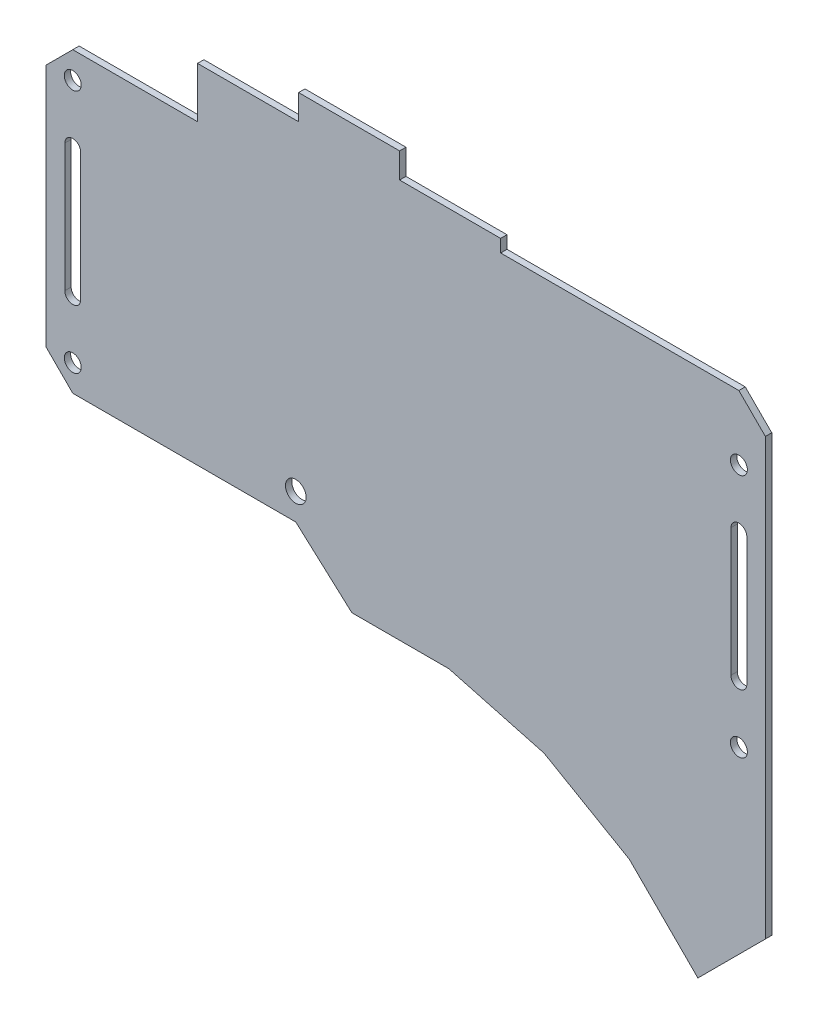
ISO-10303-21;
HEADER;
FILE_DESCRIPTION(('STEP AP214'),'2;1');
FILE_NAME('part.step','',(''),(''),'','','');
FILE_SCHEMA(('AUTOMOTIVE_DESIGN { 1 0 10303 214 1 1 1 1 }'));
ENDSEC;
DATA;
#1=APPLICATION_CONTEXT('core data for automotive mechanical design processes');
#2=APPLICATION_PROTOCOL_DEFINITION('international standard','automotive_design',2000,#1);
#3=PRODUCT_CONTEXT('',#1,'mechanical');
#4=PRODUCT('Part','Part','',(#3));
#5=PRODUCT_RELATED_PRODUCT_CATEGORY('part','',(#4));
#6=PRODUCT_DEFINITION_FORMATION('','',#4);
#7=PRODUCT_DEFINITION_CONTEXT('part definition',#1,'design');
#8=PRODUCT_DEFINITION('design','',#6,#7);
#9=PRODUCT_DEFINITION_SHAPE('','',#8);
#10=(LENGTH_UNIT() NAMED_UNIT(*) SI_UNIT(.MILLI.,.METRE.));
#11=(NAMED_UNIT(*) PLANE_ANGLE_UNIT() SI_UNIT($,.RADIAN.));
#12=(NAMED_UNIT(*) SI_UNIT($,.STERADIAN.) SOLID_ANGLE_UNIT());
#13=UNCERTAINTY_MEASURE_WITH_UNIT(LENGTH_MEASURE(1.E-05),#10,'distance_accuracy_value','');
#14=(GEOMETRIC_REPRESENTATION_CONTEXT(3) GLOBAL_UNCERTAINTY_ASSIGNED_CONTEXT((#13)) GLOBAL_UNIT_ASSIGNED_CONTEXT((#10,
#11,#12)) REPRESENTATION_CONTEXT('',''));
#15=CARTESIAN_POINT('',(0.,0.,0.));
#16=DIRECTION('',(0.,0.,1.));
#17=DIRECTION('',(1.,0.,0.));
#18=AXIS2_PLACEMENT_3D('',#15,#16,#17);
#19=CARTESIAN_POINT('',(0.,0.,1.2));
#20=DIRECTION('',(0.,0.,1.));
#21=DIRECTION('',(1.,0.,0.));
#22=AXIS2_PLACEMENT_3D('',#19,#20,#21);
#23=PLANE('',#22);
#24=CARTESIAN_POINT('',(140.259827188564,42.4727,1.2));
#25=DIRECTION('',(0.,0.,1.));
#26=DIRECTION('',(1.,0.,0.));
#27=AXIS2_PLACEMENT_3D('',#24,#25,#26);
#28=CIRCLE('',#27,1.59999999999999);
#29=CARTESIAN_POINT('',(141.859827188564,42.4727,1.2));
#30=VERTEX_POINT('',#29);
#31=EDGE_CURVE('E866',#30,#30,#28,.T.);
#32=ORIENTED_EDGE('',*,*,#31,.F.);
#33=EDGE_LOOP('',(#32));
#34=FACE_BOUND('',#33,.T.);
#35=CARTESIAN_POINT('',(14.6697,88.5719,1.2));
#36=DIRECTION('',(0.,0.,1.));
#37=DIRECTION('',(1.,0.,0.));
#38=AXIS2_PLACEMENT_3D('',#35,#36,#37);
#39=CIRCLE('',#38,1.6);
#40=CARTESIAN_POINT('',(16.2697,88.5719,1.2));
#41=VERTEX_POINT('',#40);
#42=EDGE_CURVE('E878',#41,#41,#39,.T.);
#43=ORIENTED_EDGE('',*,*,#42,.F.);
#44=EDGE_LOOP('',(#43));
#45=FACE_BOUND('',#44,.T.);
#46=DIRECTION('',(0.,-1.,0.));
#47=VECTOR('',#46,1.);
#48=CARTESIAN_POINT('',(138.759827188564,77.5727,1.2));
#49=LINE('',#48,#47);
#50=CARTESIAN_POINT('',(138.759827188564,77.5727,1.2));
#51=VERTEX_POINT('',#50);
#52=CARTESIAN_POINT('',(138.759827188564,53.4719,1.2));
#53=VERTEX_POINT('',#52);
#54=EDGE_CURVE('E232',#51,#53,#49,.T.);
#55=ORIENTED_EDGE('',*,*,#54,.F.);
#56=CARTESIAN_POINT('',(140.259827188564,77.5727,1.2));
#57=DIRECTION('',(0.,0.,1.));
#58=DIRECTION('',(1.,0.,0.));
#59=AXIS2_PLACEMENT_3D('',#56,#57,#58);
#60=CIRCLE('',#59,1.5);
#61=CARTESIAN_POINT('',(141.759827188564,77.5727,1.2));
#62=VERTEX_POINT('',#61);
#63=EDGE_CURVE('E224',#62,#51,#60,.T.);
#64=ORIENTED_EDGE('',*,*,#63,.F.);
#65=DIRECTION('',(0.,1.,0.));
#66=VECTOR('',#65,1.);
#67=CARTESIAN_POINT('',(141.759827188564,77.5727,1.2));
#68=LINE('',#67,#66);
#69=CARTESIAN_POINT('',(141.759827188564,53.4719,1.2));
#70=VERTEX_POINT('',#69);
#71=EDGE_CURVE('E247',#70,#62,#68,.T.);
#72=ORIENTED_EDGE('',*,*,#71,.F.);
#73=CARTESIAN_POINT('',(140.259827188564,53.4719,1.2));
#74=DIRECTION('',(0.,0.,1.));
#75=DIRECTION('',(1.,0.,0.));
#76=AXIS2_PLACEMENT_3D('',#73,#74,#75);
#77=CIRCLE('',#76,1.5);
#78=EDGE_CURVE('E245',#53,#70,#77,.T.);
#79=ORIENTED_EDGE('',*,*,#78,.F.);
#80=EDGE_LOOP('',(#55,#64,#72,#79));
#81=FACE_BOUND('',#80,.T.);
#82=DIRECTION('',(0.,-1.,0.));
#83=VECTOR('',#82,1.);
#84=CARTESIAN_POINT('',(13.1697,77.5727,1.2));
#85=LINE('',#84,#83);
#86=CARTESIAN_POINT('',(13.1697,77.5727,1.2));
#87=VERTEX_POINT('',#86);
#88=CARTESIAN_POINT('',(13.1697,53.4719,1.2));
#89=VERTEX_POINT('',#88);
#90=EDGE_CURVE('E265',#87,#89,#85,.T.);
#91=ORIENTED_EDGE('',*,*,#90,.F.);
#92=CARTESIAN_POINT('',(14.6697,77.5727,1.2));
#93=DIRECTION('',(0.,0.,1.));
#94=DIRECTION('',(1.,0.,0.));
#95=AXIS2_PLACEMENT_3D('',#92,#93,#94);
#96=CIRCLE('',#95,1.5);
#97=CARTESIAN_POINT('',(16.1697,77.5727,1.2));
#98=VERTEX_POINT('',#97);
#99=EDGE_CURVE('E263',#98,#87,#96,.T.);
#100=ORIENTED_EDGE('',*,*,#99,.F.);
#101=DIRECTION('',(0.,1.,0.));
#102=VECTOR('',#101,1.);
#103=CARTESIAN_POINT('',(16.1697,77.5727,1.2));
#104=LINE('',#103,#102);
#105=CARTESIAN_POINT('',(16.1697,53.4719,1.2));
#106=VERTEX_POINT('',#105);
#107=EDGE_CURVE('E271',#106,#98,#104,.T.);
#108=ORIENTED_EDGE('',*,*,#107,.F.);
#109=CARTESIAN_POINT('',(14.6697,53.4719,1.2));
#110=DIRECTION('',(0.,0.,1.));
#111=DIRECTION('',(1.,0.,0.));
#112=AXIS2_PLACEMENT_3D('',#109,#110,#111);
#113=CIRCLE('',#112,1.5);
#114=EDGE_CURVE('E268',#89,#106,#113,.T.);
#115=ORIENTED_EDGE('',*,*,#114,.F.);
#116=EDGE_LOOP('',(#91,#100,#108,#115));
#117=FACE_BOUND('',#116,.T.);
#118=DIRECTION('',(0.866049982689169,-0.499957425671517,0.));
#119=VECTOR('',#118,1.);
#120=CARTESIAN_POINT('',(119.601627138903,13.8565179668442,1.2));
#121=LINE('',#120,#119);
#122=CARTESIAN_POINT('',(103.516430017738,23.1422565556794,1.2));
#123=VERTEX_POINT('',#122);
#124=CARTESIAN_POINT('',(119.601627138903,13.8565179668442,1.2));
#125=VERTEX_POINT('',#124);
#126=EDGE_CURVE('E294',#123,#125,#121,.T.);
#127=ORIENTED_EDGE('',*,*,#126,.T.);
#128=DIRECTION('',(0.707112852331438,-0.707100709989531,0.));
#129=VECTOR('',#128,1.);
#130=CARTESIAN_POINT('',(132.532309310506,0.926057837258414,1.2));
#131=LINE('',#130,#129);
#132=CARTESIAN_POINT('',(132.532309310506,0.926057837258414,1.2));
#133=VERTEX_POINT('',#132);
#134=EDGE_CURVE('E297',#125,#133,#131,.T.);
#135=ORIENTED_EDGE('',*,*,#134,.T.);
#136=DIRECTION('',(0.70710070998953,0.707112852331438,0.));
#137=VECTOR('',#136,1.);
#138=CARTESIAN_POINT('',(145.259827188564,13.6537942724065,1.2));
#139=LINE('',#138,#137);
#140=CARTESIAN_POINT('',(145.259827188564,13.6537942724065,1.2));
#141=VERTEX_POINT('',#140);
#142=EDGE_CURVE('E300',#133,#141,#139,.T.);
#143=ORIENTED_EDGE('',*,*,#142,.T.);
#144=DIRECTION('',(0.,1.,0.));
#145=VECTOR('',#144,1.);
#146=CARTESIAN_POINT('',(145.259827188564,13.6537942724065,1.2));
#147=LINE('',#146,#145);
#148=CARTESIAN_POINT('',(145.259827188564,95.7157,1.2));
#149=VERTEX_POINT('',#148);
#150=EDGE_CURVE('E302',#141,#149,#147,.T.);
#151=ORIENTED_EDGE('',*,*,#150,.T.);
#152=DIRECTION('',(-0.707106781186547,0.707106781186547,0.));
#153=VECTOR('',#152,1.);
#154=CARTESIAN_POINT('',(145.259827188564,95.7157,1.2));
#155=LINE('',#154,#153);
#156=CARTESIAN_POINT('',(140.259827188564,100.7157,1.2));
#157=VERTEX_POINT('',#156);
#158=EDGE_CURVE('E304',#149,#157,#155,.T.);
#159=ORIENTED_EDGE('',*,*,#158,.T.);
#160=DIRECTION('',(-1.,0.,0.));
#161=VECTOR('',#160,1.);
#162=CARTESIAN_POINT('',(140.259827188564,100.7157,1.2));
#163=LINE('',#162,#161);
#164=CARTESIAN_POINT('',(95.34435,100.7157,1.2));
#165=VERTEX_POINT('',#164);
#166=EDGE_CURVE('E306',#157,#165,#163,.T.);
#167=ORIENTED_EDGE('',*,*,#166,.T.);
#168=DIRECTION('',(0.,1.,0.));
#169=VECTOR('',#168,1.);
#170=CARTESIAN_POINT('',(95.34435,100.7157,1.2));
#171=LINE('',#170,#169);
#172=CARTESIAN_POINT('',(95.34435,103.097,1.2));
#173=VERTEX_POINT('',#172);
#174=EDGE_CURVE('E308',#165,#173,#171,.T.);
#175=ORIENTED_EDGE('',*,*,#174,.T.);
#176=DIRECTION('',(-1.,0.,0.));
#177=VECTOR('',#176,1.);
#178=CARTESIAN_POINT('',(95.34435,103.097,1.2));
#179=LINE('',#178,#177);
#180=CARTESIAN_POINT('',(76.29435,103.097,1.2));
#181=VERTEX_POINT('',#180);
#182=EDGE_CURVE('E310',#173,#181,#179,.T.);
#183=ORIENTED_EDGE('',*,*,#182,.T.);
#184=DIRECTION('',(0.,1.,0.));
#185=VECTOR('',#184,1.);
#186=CARTESIAN_POINT('',(76.29435,103.097,1.2));
#187=LINE('',#186,#185);
#188=CARTESIAN_POINT('',(76.29435,107.859,1.2));
#189=VERTEX_POINT('',#188);
#190=EDGE_CURVE('E312',#181,#189,#187,.T.);
#191=ORIENTED_EDGE('',*,*,#190,.T.);
#192=DIRECTION('',(-1.,0.,0.));
#193=VECTOR('',#192,1.);
#194=CARTESIAN_POINT('',(57.24435,107.859,1.2));
#195=LINE('',#194,#193);
#196=CARTESIAN_POINT('',(57.24435,107.859,1.2));
#197=VERTEX_POINT('',#196);
#198=EDGE_CURVE('E314',#189,#197,#195,.T.);
#199=ORIENTED_EDGE('',*,*,#198,.T.);
#200=DIRECTION('',(0.,-1.,0.));
#201=VECTOR('',#200,1.);
#202=CARTESIAN_POINT('',(57.24435,103.097,1.2));
#203=LINE('',#202,#201);
#204=CARTESIAN_POINT('',(57.24435,103.097,1.2));
#205=VERTEX_POINT('',#204);
#206=EDGE_CURVE('E316',#197,#205,#203,.T.);
#207=ORIENTED_EDGE('',*,*,#206,.T.);
#208=DIRECTION('',(-1.,0.,0.));
#209=VECTOR('',#208,1.);
#210=CARTESIAN_POINT('',(38.19435,103.097,1.2));
#211=LINE('',#210,#209);
#212=CARTESIAN_POINT('',(38.19435,103.097,1.2));
#213=VERTEX_POINT('',#212);
#214=EDGE_CURVE('E318',#205,#213,#211,.T.);
#215=ORIENTED_EDGE('',*,*,#214,.T.);
#216=DIRECTION('',(0.,-1.,0.));
#217=VECTOR('',#216,1.);
#218=CARTESIAN_POINT('',(38.19435,93.5719,1.2));
#219=LINE('',#218,#217);
#220=CARTESIAN_POINT('',(38.19435,93.5719,1.2));
#221=VERTEX_POINT('',#220);
#222=EDGE_CURVE('E320',#213,#221,#219,.T.);
#223=ORIENTED_EDGE('',*,*,#222,.T.);
#224=DIRECTION('',(-1.,0.,0.));
#225=VECTOR('',#224,1.);
#226=CARTESIAN_POINT('',(38.19435,93.5719,1.2));
#227=LINE('',#226,#225);
#228=CARTESIAN_POINT('',(14.6697,93.5719,1.2));
#229=VERTEX_POINT('',#228);
#230=EDGE_CURVE('E322',#221,#229,#227,.T.);
#231=ORIENTED_EDGE('',*,*,#230,.T.);
#232=DIRECTION('',(-0.707106781186547,-0.707106781186548,0.));
#233=VECTOR('',#232,1.);
#234=CARTESIAN_POINT('',(14.6697,93.5719,1.2));
#235=LINE('',#234,#233);
#236=CARTESIAN_POINT('',(9.6697,88.5719,1.2));
#237=VERTEX_POINT('',#236);
#238=EDGE_CURVE('E324',#229,#237,#235,.T.);
#239=ORIENTED_EDGE('',*,*,#238,.T.);
#240=DIRECTION('',(0.,-1.,0.));
#241=VECTOR('',#240,1.);
#242=CARTESIAN_POINT('',(9.6697,88.5719,1.2));
#243=LINE('',#242,#241);
#244=CARTESIAN_POINT('',(9.6697,42.4727,1.2));
#245=VERTEX_POINT('',#244);
#246=EDGE_CURVE('E326',#237,#245,#243,.T.);
#247=ORIENTED_EDGE('',*,*,#246,.T.);
#248=DIRECTION('',(0.707106781186548,-0.707106781186547,0.));
#249=VECTOR('',#248,1.);
#250=CARTESIAN_POINT('',(9.6697,42.4727,1.2));
#251=LINE('',#250,#249);
#252=CARTESIAN_POINT('',(14.6697,37.4727,1.2));
#253=VERTEX_POINT('',#252);
#254=EDGE_CURVE('E328',#245,#253,#251,.T.);
#255=ORIENTED_EDGE('',*,*,#254,.T.);
#256=DIRECTION('',(1.,0.,0.));
#257=VECTOR('',#256,1.);
#258=CARTESIAN_POINT('',(14.6697,37.4727,1.2));
#259=LINE('',#258,#257);
#260=CARTESIAN_POINT('',(56.719,37.4727,1.2));
#261=VERTEX_POINT('',#260);
#262=EDGE_CURVE('E330',#253,#261,#259,.T.);
#263=ORIENTED_EDGE('',*,*,#262,.T.);
#264=DIRECTION('',(0.743047099213578,-0.669239126434107,0.));
#265=VECTOR('',#264,1.);
#266=CARTESIAN_POINT('',(56.719,37.4727,1.2));
#267=LINE('',#266,#265);
#268=CARTESIAN_POINT('',(67.2947,27.9475,1.2));
#269=VERTEX_POINT('',#268);
#270=EDGE_CURVE('E332',#261,#269,#267,.T.);
#271=ORIENTED_EDGE('',*,*,#270,.T.);
#272=DIRECTION('',(1.,0.,0.));
#273=VECTOR('',#272,1.);
#274=CARTESIAN_POINT('',(85.5864626809759,27.9475,1.2));
#275=LINE('',#274,#273);
#276=CARTESIAN_POINT('',(85.5864626809759,27.9475,1.2));
#277=VERTEX_POINT('',#276);
#278=EDGE_CURVE('E334',#269,#277,#275,.T.);
#279=ORIENTED_EDGE('',*,*,#278,.T.);
#280=DIRECTION('',(0.965913391964833,-0.258865446174246,0.));
#281=VECTOR('',#280,1.);
#282=CARTESIAN_POINT('',(103.516430017738,23.1422565556794,1.2));
#283=LINE('',#282,#281);
#284=EDGE_CURVE('E336',#277,#123,#283,.T.);
#285=ORIENTED_EDGE('',*,*,#284,.T.);
#286=EDGE_LOOP('',(#127,#135,#143,#151,#159,#167,#175,#183,#191,#199,#207,#215,#223,#231,#239,
#247,#255,#263,#271,#279,#285));
#287=FACE_BOUND('',#286,.T.);
#288=CARTESIAN_POINT('',(14.6697,42.4727,1.2));
#289=DIRECTION('',(0.,0.,1.));
#290=DIRECTION('',(1.,0.,0.));
#291=AXIS2_PLACEMENT_3D('',#288,#289,#290);
#292=CIRCLE('',#291,1.6);
#293=CARTESIAN_POINT('',(16.2697,42.4727,1.2));
#294=VERTEX_POINT('',#293);
#295=EDGE_CURVE('E253',#294,#294,#292,.T.);
#296=ORIENTED_EDGE('',*,*,#295,.F.);
#297=EDGE_LOOP('',(#296));
#298=FACE_BOUND('',#297,.T.);
#299=CARTESIAN_POINT('',(140.259827188564,88.5719,1.2));
#300=DIRECTION('',(0.,0.,1.));
#301=DIRECTION('',(1.,0.,0.));
#302=AXIS2_PLACEMENT_3D('',#299,#300,#301);
#303=CIRCLE('',#302,1.59999999999999);
#304=CARTESIAN_POINT('',(141.859827188564,88.5719,1.2));
#305=VERTEX_POINT('',#304);
#306=EDGE_CURVE('E872',#305,#305,#303,.T.);
#307=ORIENTED_EDGE('',*,*,#306,.F.);
#308=EDGE_LOOP('',(#307));
#309=FACE_BOUND('',#308,.T.);
#310=CARTESIAN_POINT('',(56.719,42.4727,1.2));
#311=DIRECTION('',(0.,0.,1.));
#312=DIRECTION('',(1.,0.,0.));
#313=AXIS2_PLACEMENT_3D('',#310,#311,#312);
#314=CIRCLE('',#313,1.9483269613107);
#315=CARTESIAN_POINT('',(58.6673269613107,42.4727,1.2));
#316=VERTEX_POINT('',#315);
#317=EDGE_CURVE('E857',#316,#316,#314,.T.);
#318=ORIENTED_EDGE('',*,*,#317,.F.);
#319=EDGE_LOOP('',(#318));
#320=FACE_BOUND('',#319,.T.);
#321=ADVANCED_FACE('F33',(#34,#45,#81,#117,#287,#298,#309,#320),#23,.T.);
#322=CARTESIAN_POINT('',(0.,0.,0.));
#323=DIRECTION('',(0.,0.,1.));
#324=DIRECTION('',(1.,0.,0.));
#325=AXIS2_PLACEMENT_3D('',#322,#323,#324);
#326=PLANE('',#325);
#327=CARTESIAN_POINT('',(14.6697,77.5727,0.));
#328=DIRECTION('',(0.,0.,1.));
#329=DIRECTION('',(1.,0.,0.));
#330=AXIS2_PLACEMENT_3D('',#327,#328,#329);
#331=CIRCLE('',#330,1.5);
#332=CARTESIAN_POINT('',(16.1697,77.5727,0.));
#333=VERTEX_POINT('',#332);
#334=CARTESIAN_POINT('',(13.1697,77.5727,0.));
#335=VERTEX_POINT('',#334);
#336=EDGE_CURVE('E240',#333,#335,#331,.T.);
#337=ORIENTED_EDGE('',*,*,#336,.T.);
#338=DIRECTION('',(0.,-1.,0.));
#339=VECTOR('',#338,1.);
#340=CARTESIAN_POINT('',(13.1697,77.5727,0.));
#341=LINE('',#340,#339);
#342=CARTESIAN_POINT('',(13.1697,53.4719,0.));
#343=VERTEX_POINT('',#342);
#344=EDGE_CURVE('E276',#335,#343,#341,.T.);
#345=ORIENTED_EDGE('',*,*,#344,.T.);
#346=CARTESIAN_POINT('',(14.6697,53.4719,0.));
#347=DIRECTION('',(0.,0.,1.));
#348=DIRECTION('',(1.,0.,0.));
#349=AXIS2_PLACEMENT_3D('',#346,#347,#348);
#350=CIRCLE('',#349,1.5);
#351=CARTESIAN_POINT('',(16.1697,53.4719,0.));
#352=VERTEX_POINT('',#351);
#353=EDGE_CURVE('E279',#343,#352,#350,.T.);
#354=ORIENTED_EDGE('',*,*,#353,.T.);
#355=DIRECTION('',(0.,1.,0.));
#356=VECTOR('',#355,1.);
#357=CARTESIAN_POINT('',(16.1697,77.5727,0.));
#358=LINE('',#357,#356);
#359=EDGE_CURVE('E266',#352,#333,#358,.T.);
#360=ORIENTED_EDGE('',*,*,#359,.T.);
#361=EDGE_LOOP('',(#337,#345,#354,#360));
#362=FACE_BOUND('',#361,.T.);
#363=DIRECTION('',(0.866049982689169,-0.499957425671517,0.));
#364=VECTOR('',#363,1.);
#365=CARTESIAN_POINT('',(119.601627138903,13.8565179668442,0.));
#366=LINE('',#365,#364);
#367=CARTESIAN_POINT('',(103.516430017738,23.1422565556794,0.));
#368=VERTEX_POINT('',#367);
#369=CARTESIAN_POINT('',(119.601627138903,13.8565179668442,0.));
#370=VERTEX_POINT('',#369);
#371=EDGE_CURVE('E293',#368,#370,#366,.T.);
#372=ORIENTED_EDGE('',*,*,#371,.F.);
#373=DIRECTION('',(0.965913391964833,-0.258865446174246,0.));
#374=VECTOR('',#373,1.);
#375=CARTESIAN_POINT('',(103.516430017738,23.1422565556794,0.));
#376=LINE('',#375,#374);
#377=CARTESIAN_POINT('',(85.5864626809759,27.9475,0.));
#378=VERTEX_POINT('',#377);
#379=EDGE_CURVE('E298',#378,#368,#376,.T.);
#380=ORIENTED_EDGE('',*,*,#379,.F.);
#381=DIRECTION('',(1.,0.,0.));
#382=VECTOR('',#381,1.);
#383=CARTESIAN_POINT('',(85.5864626809759,27.9475,0.));
#384=LINE('',#383,#382);
#385=CARTESIAN_POINT('',(67.2947,27.9475,0.));
#386=VERTEX_POINT('',#385);
#387=EDGE_CURVE('E377',#386,#378,#384,.T.);
#388=ORIENTED_EDGE('',*,*,#387,.F.);
#389=DIRECTION('',(0.743047099213578,-0.669239126434107,0.));
#390=VECTOR('',#389,1.);
#391=CARTESIAN_POINT('',(56.719,37.4727,0.));
#392=LINE('',#391,#390);
#393=CARTESIAN_POINT('',(56.719,37.4727,0.));
#394=VERTEX_POINT('',#393);
#395=EDGE_CURVE('E375',#394,#386,#392,.T.);
#396=ORIENTED_EDGE('',*,*,#395,.F.);
#397=DIRECTION('',(1.,0.,0.));
#398=VECTOR('',#397,1.);
#399=CARTESIAN_POINT('',(14.6697,37.4727,0.));
#400=LINE('',#399,#398);
#401=CARTESIAN_POINT('',(14.6697,37.4727,0.));
#402=VERTEX_POINT('',#401);
#403=EDGE_CURVE('E373',#402,#394,#400,.T.);
#404=ORIENTED_EDGE('',*,*,#403,.F.);
#405=DIRECTION('',(0.707106781186548,-0.707106781186547,0.));
#406=VECTOR('',#405,1.);
#407=CARTESIAN_POINT('',(9.6697,42.4727,0.));
#408=LINE('',#407,#406);
#409=CARTESIAN_POINT('',(9.6697,42.4727,0.));
#410=VERTEX_POINT('',#409);
#411=EDGE_CURVE('E371',#410,#402,#408,.T.);
#412=ORIENTED_EDGE('',*,*,#411,.F.);
#413=DIRECTION('',(0.,-1.,0.));
#414=VECTOR('',#413,1.);
#415=CARTESIAN_POINT('',(9.6697,88.5719,0.));
#416=LINE('',#415,#414);
#417=CARTESIAN_POINT('',(9.6697,88.5719,0.));
#418=VERTEX_POINT('',#417);
#419=EDGE_CURVE('E369',#418,#410,#416,.T.);
#420=ORIENTED_EDGE('',*,*,#419,.F.);
#421=DIRECTION('',(-0.707106781186547,-0.707106781186548,0.));
#422=VECTOR('',#421,1.);
#423=CARTESIAN_POINT('',(14.6697,93.5719,0.));
#424=LINE('',#423,#422);
#425=CARTESIAN_POINT('',(14.6697,93.5719,0.));
#426=VERTEX_POINT('',#425);
#427=EDGE_CURVE('E367',#426,#418,#424,.T.);
#428=ORIENTED_EDGE('',*,*,#427,.F.);
#429=DIRECTION('',(-1.,0.,0.));
#430=VECTOR('',#429,1.);
#431=CARTESIAN_POINT('',(38.19435,93.5719,0.));
#432=LINE('',#431,#430);
#433=CARTESIAN_POINT('',(38.19435,93.5719,0.));
#434=VERTEX_POINT('',#433);
#435=EDGE_CURVE('E365',#434,#426,#432,.T.);
#436=ORIENTED_EDGE('',*,*,#435,.F.);
#437=DIRECTION('',(0.,-1.,0.));
#438=VECTOR('',#437,1.);
#439=CARTESIAN_POINT('',(38.19435,93.5719,0.));
#440=LINE('',#439,#438);
#441=CARTESIAN_POINT('',(38.19435,103.097,0.));
#442=VERTEX_POINT('',#441);
#443=EDGE_CURVE('E363',#442,#434,#440,.T.);
#444=ORIENTED_EDGE('',*,*,#443,.F.);
#445=DIRECTION('',(-1.,0.,0.));
#446=VECTOR('',#445,1.);
#447=CARTESIAN_POINT('',(38.19435,103.097,0.));
#448=LINE('',#447,#446);
#449=CARTESIAN_POINT('',(57.24435,103.097,0.));
#450=VERTEX_POINT('',#449);
#451=EDGE_CURVE('E361',#450,#442,#448,.T.);
#452=ORIENTED_EDGE('',*,*,#451,.F.);
#453=DIRECTION('',(0.,-1.,0.));
#454=VECTOR('',#453,1.);
#455=CARTESIAN_POINT('',(57.24435,103.097,0.));
#456=LINE('',#455,#454);
#457=CARTESIAN_POINT('',(57.24435,107.859,0.));
#458=VERTEX_POINT('',#457);
#459=EDGE_CURVE('E359',#458,#450,#456,.T.);
#460=ORIENTED_EDGE('',*,*,#459,.F.);
#461=DIRECTION('',(-1.,0.,0.));
#462=VECTOR('',#461,1.);
#463=CARTESIAN_POINT('',(57.24435,107.859,0.));
#464=LINE('',#463,#462);
#465=CARTESIAN_POINT('',(76.29435,107.859,0.));
#466=VERTEX_POINT('',#465);
#467=EDGE_CURVE('E357',#466,#458,#464,.T.);
#468=ORIENTED_EDGE('',*,*,#467,.F.);
#469=DIRECTION('',(0.,1.,0.));
#470=VECTOR('',#469,1.);
#471=CARTESIAN_POINT('',(76.29435,103.097,0.));
#472=LINE('',#471,#470);
#473=CARTESIAN_POINT('',(76.29435,103.097,0.));
#474=VERTEX_POINT('',#473);
#475=EDGE_CURVE('E355',#474,#466,#472,.T.);
#476=ORIENTED_EDGE('',*,*,#475,.F.);
#477=DIRECTION('',(-1.,0.,0.));
#478=VECTOR('',#477,1.);
#479=CARTESIAN_POINT('',(95.34435,103.097,0.));
#480=LINE('',#479,#478);
#481=CARTESIAN_POINT('',(95.34435,103.097,0.));
#482=VERTEX_POINT('',#481);
#483=EDGE_CURVE('E353',#482,#474,#480,.T.);
#484=ORIENTED_EDGE('',*,*,#483,.F.);
#485=DIRECTION('',(0.,1.,0.));
#486=VECTOR('',#485,1.);
#487=CARTESIAN_POINT('',(95.34435,100.7157,0.));
#488=LINE('',#487,#486);
#489=CARTESIAN_POINT('',(95.34435,100.7157,0.));
#490=VERTEX_POINT('',#489);
#491=EDGE_CURVE('E351',#490,#482,#488,.T.);
#492=ORIENTED_EDGE('',*,*,#491,.F.);
#493=DIRECTION('',(-1.,0.,0.));
#494=VECTOR('',#493,1.);
#495=CARTESIAN_POINT('',(140.259827188564,100.7157,0.));
#496=LINE('',#495,#494);
#497=CARTESIAN_POINT('',(140.259827188564,100.7157,0.));
#498=VERTEX_POINT('',#497);
#499=EDGE_CURVE('E349',#498,#490,#496,.T.);
#500=ORIENTED_EDGE('',*,*,#499,.F.);
#501=DIRECTION('',(-0.707106781186547,0.707106781186547,0.));
#502=VECTOR('',#501,1.);
#503=CARTESIAN_POINT('',(145.259827188564,95.7157,0.));
#504=LINE('',#503,#502);
#505=CARTESIAN_POINT('',(145.259827188564,95.7157,0.));
#506=VERTEX_POINT('',#505);
#507=EDGE_CURVE('E347',#506,#498,#504,.T.);
#508=ORIENTED_EDGE('',*,*,#507,.F.);
#509=DIRECTION('',(0.,1.,0.));
#510=VECTOR('',#509,1.);
#511=CARTESIAN_POINT('',(145.259827188564,13.6537942724065,0.));
#512=LINE('',#511,#510);
#513=CARTESIAN_POINT('',(145.259827188564,13.6537942724065,0.));
#514=VERTEX_POINT('',#513);
#515=EDGE_CURVE('E345',#514,#506,#512,.T.);
#516=ORIENTED_EDGE('',*,*,#515,.F.);
#517=DIRECTION('',(0.70710070998953,0.707112852331438,0.));
#518=VECTOR('',#517,1.);
#519=CARTESIAN_POINT('',(145.259827188564,13.6537942724065,0.));
#520=LINE('',#519,#518);
#521=CARTESIAN_POINT('',(132.532309310506,0.926057837258414,0.));
#522=VERTEX_POINT('',#521);
#523=EDGE_CURVE('E343',#522,#514,#520,.T.);
#524=ORIENTED_EDGE('',*,*,#523,.F.);
#525=DIRECTION('',(0.707112852331438,-0.707100709989531,0.));
#526=VECTOR('',#525,1.);
#527=CARTESIAN_POINT('',(132.532309310506,0.926057837258414,0.));
#528=LINE('',#527,#526);
#529=EDGE_CURVE('E341',#370,#522,#528,.T.);
#530=ORIENTED_EDGE('',*,*,#529,.F.);
#531=EDGE_LOOP('',(#372,#380,#388,#396,#404,#412,#420,#428,#436,#444,#452,#460,#468,#476,#484,
#492,#500,#508,#516,#524,#530));
#532=FACE_BOUND('',#531,.T.);
#533=CARTESIAN_POINT('',(140.259827188564,77.5727,0.));
#534=DIRECTION('',(0.,0.,1.));
#535=DIRECTION('',(1.,0.,0.));
#536=AXIS2_PLACEMENT_3D('',#533,#534,#535);
#537=CIRCLE('',#536,1.5);
#538=CARTESIAN_POINT('',(141.759827188564,77.5727,0.));
#539=VERTEX_POINT('',#538);
#540=CARTESIAN_POINT('',(138.759827188564,77.5727,0.));
#541=VERTEX_POINT('',#540);
#542=EDGE_CURVE('E56',#539,#541,#537,.T.);
#543=ORIENTED_EDGE('',*,*,#542,.T.);
#544=DIRECTION('',(0.,-1.,0.));
#545=VECTOR('',#544,1.);
#546=CARTESIAN_POINT('',(138.759827188564,77.5727,0.));
#547=LINE('',#546,#545);
#548=CARTESIAN_POINT('',(138.759827188564,53.4719,0.));
#549=VERTEX_POINT('',#548);
#550=EDGE_CURVE('E239',#541,#549,#547,.T.);
#551=ORIENTED_EDGE('',*,*,#550,.T.);
#552=CARTESIAN_POINT('',(140.259827188564,53.4719,0.));
#553=DIRECTION('',(0.,0.,1.));
#554=DIRECTION('',(1.,0.,0.));
#555=AXIS2_PLACEMENT_3D('',#552,#553,#554);
#556=CIRCLE('',#555,1.5);
#557=CARTESIAN_POINT('',(141.759827188564,53.4719,0.));
#558=VERTEX_POINT('',#557);
#559=EDGE_CURVE('E255',#549,#558,#556,.T.);
#560=ORIENTED_EDGE('',*,*,#559,.T.);
#561=DIRECTION('',(0.,1.,0.));
#562=VECTOR('',#561,1.);
#563=CARTESIAN_POINT('',(141.759827188564,77.5727,0.));
#564=LINE('',#563,#562);
#565=EDGE_CURVE('E233',#558,#539,#564,.T.);
#566=ORIENTED_EDGE('',*,*,#565,.T.);
#567=EDGE_LOOP('',(#543,#551,#560,#566));
#568=FACE_BOUND('',#567,.T.);
#569=CARTESIAN_POINT('',(14.6697,42.4727,0.));
#570=DIRECTION('',(0.,0.,1.));
#571=DIRECTION('',(1.,0.,0.));
#572=AXIS2_PLACEMENT_3D('',#569,#570,#571);
#573=CIRCLE('',#572,1.6);
#574=CARTESIAN_POINT('',(16.2697,42.4727,0.));
#575=VERTEX_POINT('',#574);
#576=EDGE_CURVE('E881',#575,#575,#573,.T.);
#577=ORIENTED_EDGE('',*,*,#576,.T.);
#578=EDGE_LOOP('',(#577));
#579=FACE_BOUND('',#578,.T.);
#580=CARTESIAN_POINT('',(14.6697,88.5719,0.));
#581=DIRECTION('',(0.,0.,1.));
#582=DIRECTION('',(1.,0.,0.));
#583=AXIS2_PLACEMENT_3D('',#580,#581,#582);
#584=CIRCLE('',#583,1.6);
#585=CARTESIAN_POINT('',(16.2697,88.5719,0.));
#586=VERTEX_POINT('',#585);
#587=EDGE_CURVE('E875',#586,#586,#584,.T.);
#588=ORIENTED_EDGE('',*,*,#587,.T.);
#589=EDGE_LOOP('',(#588));
#590=FACE_BOUND('',#589,.T.);
#591=CARTESIAN_POINT('',(140.259827188564,88.5719,0.));
#592=DIRECTION('',(0.,0.,1.));
#593=DIRECTION('',(1.,0.,0.));
#594=AXIS2_PLACEMENT_3D('',#591,#592,#593);
#595=CIRCLE('',#594,1.59999999999999);
#596=CARTESIAN_POINT('',(141.859827188564,88.5719,0.));
#597=VERTEX_POINT('',#596);
#598=EDGE_CURVE('E869',#597,#597,#595,.T.);
#599=ORIENTED_EDGE('',*,*,#598,.T.);
#600=EDGE_LOOP('',(#599));
#601=FACE_BOUND('',#600,.T.);
#602=CARTESIAN_POINT('',(140.259827188564,42.4727,0.));
#603=DIRECTION('',(0.,0.,1.));
#604=DIRECTION('',(1.,0.,0.));
#605=AXIS2_PLACEMENT_3D('',#602,#603,#604);
#606=CIRCLE('',#605,1.59999999999999);
#607=CARTESIAN_POINT('',(141.859827188564,42.4727,0.));
#608=VERTEX_POINT('',#607);
#609=EDGE_CURVE('E863',#608,#608,#606,.T.);
#610=ORIENTED_EDGE('',*,*,#609,.T.);
#611=EDGE_LOOP('',(#610));
#612=FACE_BOUND('',#611,.T.);
#613=CARTESIAN_POINT('',(56.719,42.4727,0.));
#614=DIRECTION('',(0.,0.,1.));
#615=DIRECTION('',(1.,0.,0.));
#616=AXIS2_PLACEMENT_3D('',#613,#614,#615);
#617=CIRCLE('',#616,1.9483269613107);
#618=CARTESIAN_POINT('',(58.6673269613107,42.4727,0.));
#619=VERTEX_POINT('',#618);
#620=EDGE_CURVE('E860',#619,#619,#617,.T.);
#621=ORIENTED_EDGE('',*,*,#620,.T.);
#622=EDGE_LOOP('',(#621));
#623=FACE_BOUND('',#622,.T.);
#624=ADVANCED_FACE('F446',(#362,#532,#568,#579,#590,#601,#612,#623),#326,.F.);
#625=CARTESIAN_POINT('',(119.601627138903,13.8565179668442,1.2));
#626=DIRECTION('',(0.499957425671517,0.866049982689168,0.));
#627=DIRECTION('',(-0.866049982689169,0.499957425671518,0.));
#628=AXIS2_PLACEMENT_3D('',#625,#626,#627);
#629=PLANE('',#628);
#630=ORIENTED_EDGE('',*,*,#371,.T.);
#631=DIRECTION('',(0.,0.,-1.));
#632=VECTOR('',#631,1.);
#633=CARTESIAN_POINT('',(119.601627138903,13.8565179668442,1.2));
#634=LINE('',#633,#632);
#635=EDGE_CURVE('E11',#125,#370,#634,.T.);
#636=ORIENTED_EDGE('',*,*,#635,.F.);
#637=ORIENTED_EDGE('',*,*,#126,.F.);
#638=DIRECTION('',(0.,0.,-1.));
#639=VECTOR('',#638,1.);
#640=CARTESIAN_POINT('',(103.516430017738,23.1422565556794,1.2));
#641=LINE('',#640,#639);
#642=EDGE_CURVE('E338',#123,#368,#641,.T.);
#643=ORIENTED_EDGE('',*,*,#642,.T.);
#644=EDGE_LOOP('',(#630,#636,#637,#643));
#645=FACE_BOUND('',#644,.T.);
#646=ADVANCED_FACE('F35',(#645),#629,.F.);
#647=CARTESIAN_POINT('',(132.532309310506,0.926057837258414,1.2));
#648=DIRECTION('',(0.707100709989531,0.707112852331438,0.));
#649=DIRECTION('',(-0.707112852331438,0.707100709989531,0.));
#650=AXIS2_PLACEMENT_3D('',#647,#648,#649);
#651=PLANE('',#650);
#652=ORIENTED_EDGE('',*,*,#529,.T.);
#653=DIRECTION('',(0.,0.,-1.));
#654=VECTOR('',#653,1.);
#655=CARTESIAN_POINT('',(132.532309310506,0.926057837258414,1.2));
#656=LINE('',#655,#654);
#657=EDGE_CURVE('E41',#133,#522,#656,.T.);
#658=ORIENTED_EDGE('',*,*,#657,.F.);
#659=ORIENTED_EDGE('',*,*,#134,.F.);
#660=ORIENTED_EDGE('',*,*,#635,.T.);
#661=EDGE_LOOP('',(#652,#658,#659,#660));
#662=FACE_BOUND('',#661,.T.);
#663=ADVANCED_FACE('F464',(#662),#651,.F.);
#664=CARTESIAN_POINT('',(145.259827188564,13.6537942724065,1.2));
#665=DIRECTION('',(-0.707112852331438,0.70710070998953,0.));
#666=DIRECTION('',(-0.70710070998953,-0.707112852331438,0.));
#667=AXIS2_PLACEMENT_3D('',#664,#665,#666);
#668=PLANE('',#667);
#669=ORIENTED_EDGE('',*,*,#523,.T.);
#670=DIRECTION('',(0.,0.,-1.));
#671=VECTOR('',#670,1.);
#672=CARTESIAN_POINT('',(145.259827188564,13.6537942724065,1.2));
#673=LINE('',#672,#671);
#674=EDGE_CURVE('E433',#141,#514,#673,.T.);
#675=ORIENTED_EDGE('',*,*,#674,.F.);
#676=ORIENTED_EDGE('',*,*,#142,.F.);
#677=ORIENTED_EDGE('',*,*,#657,.T.);
#678=EDGE_LOOP('',(#669,#675,#676,#677));
#679=FACE_BOUND('',#678,.T.);
#680=ADVANCED_FACE('F440',(#679),#668,.F.);
#681=CARTESIAN_POINT('',(145.259827188564,13.6537942724065,1.2));
#682=DIRECTION('',(-1.,0.,0.));
#683=DIRECTION('',(0.,0.,1.));
#684=AXIS2_PLACEMENT_3D('',#681,#682,#683);
#685=PLANE('',#684);
#686=ORIENTED_EDGE('',*,*,#515,.T.);
#687=DIRECTION('',(0.,0.,-1.));
#688=VECTOR('',#687,1.);
#689=CARTESIAN_POINT('',(145.259827188564,95.7157,1.2));
#690=LINE('',#689,#688);
#691=EDGE_CURVE('E430',#149,#506,#690,.T.);
#692=ORIENTED_EDGE('',*,*,#691,.F.);
#693=ORIENTED_EDGE('',*,*,#150,.F.);
#694=ORIENTED_EDGE('',*,*,#674,.T.);
#695=EDGE_LOOP('',(#686,#692,#693,#694));
#696=FACE_BOUND('',#695,.T.);
#697=ADVANCED_FACE('F452',(#696),#685,.F.);
#698=CARTESIAN_POINT('',(145.259827188564,95.7157,1.2));
#699=DIRECTION('',(-0.707106781186547,-0.707106781186547,0.));
#700=DIRECTION('',(0.707106781186548,-0.707106781186548,0.));
#701=AXIS2_PLACEMENT_3D('',#698,#699,#700);
#702=PLANE('',#701);
#703=ORIENTED_EDGE('',*,*,#507,.T.);
#704=DIRECTION('',(0.,0.,-1.));
#705=VECTOR('',#704,1.);
#706=CARTESIAN_POINT('',(140.259827188564,100.7157,1.2));
#707=LINE('',#706,#705);
#708=EDGE_CURVE('E427',#157,#498,#707,.T.);
#709=ORIENTED_EDGE('',*,*,#708,.F.);
#710=ORIENTED_EDGE('',*,*,#158,.F.);
#711=ORIENTED_EDGE('',*,*,#691,.T.);
#712=EDGE_LOOP('',(#703,#709,#710,#711));
#713=FACE_BOUND('',#712,.T.);
#714=ADVANCED_FACE('F456',(#713),#702,.F.);
#715=CARTESIAN_POINT('',(140.259827188564,100.7157,1.2));
#716=DIRECTION('',(0.,-1.,0.));
#717=DIRECTION('',(0.,0.,-1.));
#718=AXIS2_PLACEMENT_3D('',#715,#716,#717);
#719=PLANE('',#718);
#720=ORIENTED_EDGE('',*,*,#499,.T.);
#721=DIRECTION('',(0.,0.,-1.));
#722=VECTOR('',#721,1.);
#723=CARTESIAN_POINT('',(95.34435,100.7157,1.2));
#724=LINE('',#723,#722);
#725=EDGE_CURVE('E424',#165,#490,#724,.T.);
#726=ORIENTED_EDGE('',*,*,#725,.F.);
#727=ORIENTED_EDGE('',*,*,#166,.F.);
#728=ORIENTED_EDGE('',*,*,#708,.T.);
#729=EDGE_LOOP('',(#720,#726,#727,#728));
#730=FACE_BOUND('',#729,.T.);
#731=ADVANCED_FACE('F542',(#730),#719,.F.);
#732=CARTESIAN_POINT('',(95.34435,100.7157,1.2));
#733=DIRECTION('',(-1.,0.,0.));
#734=DIRECTION('',(0.,0.,1.));
#735=AXIS2_PLACEMENT_3D('',#732,#733,#734);
#736=PLANE('',#735);
#737=ORIENTED_EDGE('',*,*,#491,.T.);
#738=DIRECTION('',(0.,0.,-1.));
#739=VECTOR('',#738,1.);
#740=CARTESIAN_POINT('',(95.34435,103.097,1.2));
#741=LINE('',#740,#739);
#742=EDGE_CURVE('E421',#173,#482,#741,.T.);
#743=ORIENTED_EDGE('',*,*,#742,.F.);
#744=ORIENTED_EDGE('',*,*,#174,.F.);
#745=ORIENTED_EDGE('',*,*,#725,.T.);
#746=EDGE_LOOP('',(#737,#743,#744,#745));
#747=FACE_BOUND('',#746,.T.);
#748=ADVANCED_FACE('F540',(#747),#736,.F.);
#749=CARTESIAN_POINT('',(95.34435,103.097,1.2));
#750=DIRECTION('',(0.,-1.,0.));
#751=DIRECTION('',(0.,0.,-1.));
#752=AXIS2_PLACEMENT_3D('',#749,#750,#751);
#753=PLANE('',#752);
#754=ORIENTED_EDGE('',*,*,#483,.T.);
#755=DIRECTION('',(0.,0.,-1.));
#756=VECTOR('',#755,1.);
#757=CARTESIAN_POINT('',(76.29435,103.097,1.2));
#758=LINE('',#757,#756);
#759=EDGE_CURVE('E418',#181,#474,#758,.T.);
#760=ORIENTED_EDGE('',*,*,#759,.F.);
#761=ORIENTED_EDGE('',*,*,#182,.F.);
#762=ORIENTED_EDGE('',*,*,#742,.T.);
#763=EDGE_LOOP('',(#754,#760,#761,#762));
#764=FACE_BOUND('',#763,.T.);
#765=ADVANCED_FACE('F536',(#764),#753,.F.);
#766=CARTESIAN_POINT('',(76.29435,103.097,1.2));
#767=DIRECTION('',(-1.,0.,0.));
#768=DIRECTION('',(0.,0.,1.));
#769=AXIS2_PLACEMENT_3D('',#766,#767,#768);
#770=PLANE('',#769);
#771=ORIENTED_EDGE('',*,*,#475,.T.);
#772=DIRECTION('',(0.,0.,-1.));
#773=VECTOR('',#772,1.);
#774=CARTESIAN_POINT('',(76.29435,107.859,1.2));
#775=LINE('',#774,#773);
#776=EDGE_CURVE('E415',#189,#466,#775,.T.);
#777=ORIENTED_EDGE('',*,*,#776,.F.);
#778=ORIENTED_EDGE('',*,*,#190,.F.);
#779=ORIENTED_EDGE('',*,*,#759,.T.);
#780=EDGE_LOOP('',(#771,#777,#778,#779));
#781=FACE_BOUND('',#780,.T.);
#782=ADVANCED_FACE('F531',(#781),#770,.F.);
#783=CARTESIAN_POINT('',(57.24435,107.859,1.2));
#784=DIRECTION('',(0.,-1.,0.));
#785=DIRECTION('',(0.,0.,-1.));
#786=AXIS2_PLACEMENT_3D('',#783,#784,#785);
#787=PLANE('',#786);
#788=ORIENTED_EDGE('',*,*,#467,.T.);
#789=DIRECTION('',(0.,0.,-1.));
#790=VECTOR('',#789,1.);
#791=CARTESIAN_POINT('',(57.24435,107.859,1.2));
#792=LINE('',#791,#790);
#793=EDGE_CURVE('E412',#197,#458,#792,.T.);
#794=ORIENTED_EDGE('',*,*,#793,.F.);
#795=ORIENTED_EDGE('',*,*,#198,.F.);
#796=ORIENTED_EDGE('',*,*,#776,.T.);
#797=EDGE_LOOP('',(#788,#794,#795,#796));
#798=FACE_BOUND('',#797,.T.);
#799=ADVANCED_FACE('F525',(#798),#787,.F.);
#800=CARTESIAN_POINT('',(57.24435,103.097,1.2));
#801=DIRECTION('',(1.,0.,0.));
#802=DIRECTION('',(0.,0.,-1.));
#803=AXIS2_PLACEMENT_3D('',#800,#801,#802);
#804=PLANE('',#803);
#805=ORIENTED_EDGE('',*,*,#459,.T.);
#806=DIRECTION('',(0.,0.,-1.));
#807=VECTOR('',#806,1.);
#808=CARTESIAN_POINT('',(57.24435,103.097,1.2));
#809=LINE('',#808,#807);
#810=EDGE_CURVE('E409',#205,#450,#809,.T.);
#811=ORIENTED_EDGE('',*,*,#810,.F.);
#812=ORIENTED_EDGE('',*,*,#206,.F.);
#813=ORIENTED_EDGE('',*,*,#793,.T.);
#814=EDGE_LOOP('',(#805,#811,#812,#813));
#815=FACE_BOUND('',#814,.T.);
#816=ADVANCED_FACE('F521',(#815),#804,.F.);
#817=CARTESIAN_POINT('',(38.19435,103.097,1.2));
#818=DIRECTION('',(0.,-1.,0.));
#819=DIRECTION('',(0.,0.,-1.));
#820=AXIS2_PLACEMENT_3D('',#817,#818,#819);
#821=PLANE('',#820);
#822=ORIENTED_EDGE('',*,*,#451,.T.);
#823=DIRECTION('',(0.,0.,-1.));
#824=VECTOR('',#823,1.);
#825=CARTESIAN_POINT('',(38.19435,103.097,1.2));
#826=LINE('',#825,#824);
#827=EDGE_CURVE('E406',#213,#442,#826,.T.);
#828=ORIENTED_EDGE('',*,*,#827,.F.);
#829=ORIENTED_EDGE('',*,*,#214,.F.);
#830=ORIENTED_EDGE('',*,*,#810,.T.);
#831=EDGE_LOOP('',(#822,#828,#829,#830));
#832=FACE_BOUND('',#831,.T.);
#833=ADVANCED_FACE('F516',(#832),#821,.F.);
#834=CARTESIAN_POINT('',(38.19435,93.5719,1.2));
#835=DIRECTION('',(1.,0.,0.));
#836=DIRECTION('',(0.,0.,-1.));
#837=AXIS2_PLACEMENT_3D('',#834,#835,#836);
#838=PLANE('',#837);
#839=ORIENTED_EDGE('',*,*,#443,.T.);
#840=DIRECTION('',(0.,0.,-1.));
#841=VECTOR('',#840,1.);
#842=CARTESIAN_POINT('',(38.19435,93.5719,1.2));
#843=LINE('',#842,#841);
#844=EDGE_CURVE('E403',#221,#434,#843,.T.);
#845=ORIENTED_EDGE('',*,*,#844,.F.);
#846=ORIENTED_EDGE('',*,*,#222,.F.);
#847=ORIENTED_EDGE('',*,*,#827,.T.);
#848=EDGE_LOOP('',(#839,#845,#846,#847));
#849=FACE_BOUND('',#848,.T.);
#850=ADVANCED_FACE('F510',(#849),#838,.F.);
#851=CARTESIAN_POINT('',(38.19435,93.5719,1.2));
#852=DIRECTION('',(0.,-1.,0.));
#853=DIRECTION('',(0.,0.,-1.));
#854=AXIS2_PLACEMENT_3D('',#851,#852,#853);
#855=PLANE('',#854);
#856=ORIENTED_EDGE('',*,*,#435,.T.);
#857=DIRECTION('',(0.,0.,-1.));
#858=VECTOR('',#857,1.);
#859=CARTESIAN_POINT('',(14.6697,93.5719,1.2));
#860=LINE('',#859,#858);
#861=EDGE_CURVE('E400',#229,#426,#860,.T.);
#862=ORIENTED_EDGE('',*,*,#861,.F.);
#863=ORIENTED_EDGE('',*,*,#230,.F.);
#864=ORIENTED_EDGE('',*,*,#844,.T.);
#865=EDGE_LOOP('',(#856,#862,#863,#864));
#866=FACE_BOUND('',#865,.T.);
#867=ADVANCED_FACE('F506',(#866),#855,.F.);
#868=CARTESIAN_POINT('',(14.6697,93.5719,1.2));
#869=DIRECTION('',(0.707106781186548,-0.707106781186547,0.));
#870=DIRECTION('',(0.707106781186547,0.707106781186548,0.));
#871=AXIS2_PLACEMENT_3D('',#868,#869,#870);
#872=PLANE('',#871);
#873=ORIENTED_EDGE('',*,*,#427,.T.);
#874=DIRECTION('',(0.,0.,-1.));
#875=VECTOR('',#874,1.);
#876=CARTESIAN_POINT('',(9.6697,88.5719,1.2));
#877=LINE('',#876,#875);
#878=EDGE_CURVE('E397',#237,#418,#877,.T.);
#879=ORIENTED_EDGE('',*,*,#878,.F.);
#880=ORIENTED_EDGE('',*,*,#238,.F.);
#881=ORIENTED_EDGE('',*,*,#861,.T.);
#882=EDGE_LOOP('',(#873,#879,#880,#881));
#883=FACE_BOUND('',#882,.T.);
#884=ADVANCED_FACE('F501',(#883),#872,.F.);
#885=CARTESIAN_POINT('',(9.6697,88.5719,1.2));
#886=DIRECTION('',(1.,0.,0.));
#887=DIRECTION('',(0.,0.,-1.));
#888=AXIS2_PLACEMENT_3D('',#885,#886,#887);
#889=PLANE('',#888);
#890=ORIENTED_EDGE('',*,*,#419,.T.);
#891=DIRECTION('',(0.,0.,-1.));
#892=VECTOR('',#891,1.);
#893=CARTESIAN_POINT('',(9.6697,42.4727,1.2));
#894=LINE('',#893,#892);
#895=EDGE_CURVE('E394',#245,#410,#894,.T.);
#896=ORIENTED_EDGE('',*,*,#895,.F.);
#897=ORIENTED_EDGE('',*,*,#246,.F.);
#898=ORIENTED_EDGE('',*,*,#878,.T.);
#899=EDGE_LOOP('',(#890,#896,#897,#898));
#900=FACE_BOUND('',#899,.T.);
#901=ADVANCED_FACE('F495',(#900),#889,.F.);
#902=CARTESIAN_POINT('',(9.6697,42.4727,1.2));
#903=DIRECTION('',(0.707106781186547,0.707106781186548,0.));
#904=DIRECTION('',(-0.707106781186548,0.707106781186547,0.));
#905=AXIS2_PLACEMENT_3D('',#902,#903,#904);
#906=PLANE('',#905);
#907=ORIENTED_EDGE('',*,*,#411,.T.);
#908=DIRECTION('',(0.,0.,-1.));
#909=VECTOR('',#908,1.);
#910=CARTESIAN_POINT('',(14.6697,37.4727,1.2));
#911=LINE('',#910,#909);
#912=EDGE_CURVE('E391',#253,#402,#911,.T.);
#913=ORIENTED_EDGE('',*,*,#912,.F.);
#914=ORIENTED_EDGE('',*,*,#254,.F.);
#915=ORIENTED_EDGE('',*,*,#895,.T.);
#916=EDGE_LOOP('',(#907,#913,#914,#915));
#917=FACE_BOUND('',#916,.T.);
#918=ADVANCED_FACE('F491',(#917),#906,.F.);
#919=CARTESIAN_POINT('',(14.6697,37.4727,1.2));
#920=DIRECTION('',(0.,1.,0.));
#921=DIRECTION('',(0.,0.,1.));
#922=AXIS2_PLACEMENT_3D('',#919,#920,#921);
#923=PLANE('',#922);
#924=ORIENTED_EDGE('',*,*,#403,.T.);
#925=DIRECTION('',(0.,0.,-1.));
#926=VECTOR('',#925,1.);
#927=CARTESIAN_POINT('',(56.719,37.4727,1.2));
#928=LINE('',#927,#926);
#929=EDGE_CURVE('E388',#261,#394,#928,.T.);
#930=ORIENTED_EDGE('',*,*,#929,.F.);
#931=ORIENTED_EDGE('',*,*,#262,.F.);
#932=ORIENTED_EDGE('',*,*,#912,.T.);
#933=EDGE_LOOP('',(#924,#930,#931,#932));
#934=FACE_BOUND('',#933,.T.);
#935=ADVANCED_FACE('F486',(#934),#923,.F.);
#936=CARTESIAN_POINT('',(56.719,37.4727,1.2));
#937=DIRECTION('',(0.669239126434107,0.743047099213578,0.));
#938=DIRECTION('',(-0.743047099213578,0.669239126434107,0.));
#939=AXIS2_PLACEMENT_3D('',#936,#937,#938);
#940=PLANE('',#939);
#941=ORIENTED_EDGE('',*,*,#395,.T.);
#942=DIRECTION('',(0.,0.,-1.));
#943=VECTOR('',#942,1.);
#944=CARTESIAN_POINT('',(67.2947,27.9475,1.2));
#945=LINE('',#944,#943);
#946=EDGE_CURVE('E385',#269,#386,#945,.T.);
#947=ORIENTED_EDGE('',*,*,#946,.F.);
#948=ORIENTED_EDGE('',*,*,#270,.F.);
#949=ORIENTED_EDGE('',*,*,#929,.T.);
#950=EDGE_LOOP('',(#941,#947,#948,#949));
#951=FACE_BOUND('',#950,.T.);
#952=ADVANCED_FACE('F480',(#951),#940,.F.);
#953=CARTESIAN_POINT('',(85.5864626809759,27.9475,1.2));
#954=DIRECTION('',(0.,1.,0.));
#955=DIRECTION('',(0.,0.,1.));
#956=AXIS2_PLACEMENT_3D('',#953,#954,#955);
#957=PLANE('',#956);
#958=ORIENTED_EDGE('',*,*,#387,.T.);
#959=DIRECTION('',(0.,0.,-1.));
#960=VECTOR('',#959,1.);
#961=CARTESIAN_POINT('',(85.5864626809759,27.9475,1.2));
#962=LINE('',#961,#960);
#963=EDGE_CURVE('E382',#277,#378,#962,.T.);
#964=ORIENTED_EDGE('',*,*,#963,.F.);
#965=ORIENTED_EDGE('',*,*,#278,.F.);
#966=ORIENTED_EDGE('',*,*,#946,.T.);
#967=EDGE_LOOP('',(#958,#964,#965,#966));
#968=FACE_BOUND('',#967,.T.);
#969=ADVANCED_FACE('F476',(#968),#957,.F.);
#970=CARTESIAN_POINT('',(103.516430017738,23.1422565556794,1.2));
#971=DIRECTION('',(0.258865446174246,0.965913391964833,0.));
#972=DIRECTION('',(-0.965913391964833,0.258865446174246,0.));
#973=AXIS2_PLACEMENT_3D('',#970,#971,#972);
#974=PLANE('',#973);
#975=ORIENTED_EDGE('',*,*,#379,.T.);
#976=ORIENTED_EDGE('',*,*,#642,.F.);
#977=ORIENTED_EDGE('',*,*,#284,.F.);
#978=ORIENTED_EDGE('',*,*,#963,.T.);
#979=EDGE_LOOP('',(#975,#976,#977,#978));
#980=FACE_BOUND('',#979,.T.);
#981=ADVANCED_FACE('F471',(#980),#974,.F.);
#982=CARTESIAN_POINT('',(14.6697,77.5727,1.2));
#983=DIRECTION('',(0.,0.,-1.));
#984=DIRECTION('',(-1.,0.,0.));
#985=AXIS2_PLACEMENT_3D('',#982,#983,#984);
#986=CYLINDRICAL_SURFACE('',#985,1.5);
#987=ORIENTED_EDGE('',*,*,#336,.F.);
#988=DIRECTION('',(0.,0.,-1.));
#989=VECTOR('',#988,1.);
#990=CARTESIAN_POINT('',(16.1697,77.5727,1.2));
#991=LINE('',#990,#989);
#992=EDGE_CURVE('E273',#98,#333,#991,.T.);
#993=ORIENTED_EDGE('',*,*,#992,.F.);
#994=ORIENTED_EDGE('',*,*,#99,.T.);
#995=DIRECTION('',(0.,0.,-1.));
#996=VECTOR('',#995,1.);
#997=CARTESIAN_POINT('',(13.1697,77.5727,1.2));
#998=LINE('',#997,#996);
#999=EDGE_CURVE('E290',#87,#335,#998,.T.);
#1000=ORIENTED_EDGE('',*,*,#999,.T.);
#1001=EDGE_LOOP('',(#987,#993,#994,#1000));
#1002=FACE_BOUND('',#1001,.T.);
#1003=ADVANCED_FACE('F562',(#1002),#986,.F.);
#1004=CARTESIAN_POINT('',(13.1697,77.5727,1.2));
#1005=DIRECTION('',(1.,0.,0.));
#1006=DIRECTION('',(0.,0.,-1.));
#1007=AXIS2_PLACEMENT_3D('',#1004,#1005,#1006);
#1008=PLANE('',#1007);
#1009=ORIENTED_EDGE('',*,*,#344,.F.);
#1010=ORIENTED_EDGE('',*,*,#999,.F.);
#1011=ORIENTED_EDGE('',*,*,#90,.T.);
#1012=DIRECTION('',(0.,0.,-1.));
#1013=VECTOR('',#1012,1.);
#1014=CARTESIAN_POINT('',(13.1697,53.4719,1.2));
#1015=LINE('',#1014,#1013);
#1016=EDGE_CURVE('E288',#89,#343,#1015,.T.);
#1017=ORIENTED_EDGE('',*,*,#1016,.T.);
#1018=EDGE_LOOP('',(#1009,#1010,#1011,#1017));
#1019=FACE_BOUND('',#1018,.T.);
#1020=ADVANCED_FACE('F654',(#1019),#1008,.T.);
#1021=CARTESIAN_POINT('',(14.6697,53.4719,1.2));
#1022=DIRECTION('',(0.,0.,-1.));
#1023=DIRECTION('',(-1.,0.,0.));
#1024=AXIS2_PLACEMENT_3D('',#1021,#1022,#1023);
#1025=CYLINDRICAL_SURFACE('',#1024,1.5);
#1026=ORIENTED_EDGE('',*,*,#353,.F.);
#1027=ORIENTED_EDGE('',*,*,#1016,.F.);
#1028=ORIENTED_EDGE('',*,*,#114,.T.);
#1029=DIRECTION('',(0.,0.,-1.));
#1030=VECTOR('',#1029,1.);
#1031=CARTESIAN_POINT('',(16.1697,53.4719,1.2));
#1032=LINE('',#1031,#1030);
#1033=EDGE_CURVE('E286',#106,#352,#1032,.T.);
#1034=ORIENTED_EDGE('',*,*,#1033,.T.);
#1035=EDGE_LOOP('',(#1026,#1027,#1028,#1034));
#1036=FACE_BOUND('',#1035,.T.);
#1037=ADVANCED_FACE('F661',(#1036),#1025,.F.);
#1038=CARTESIAN_POINT('',(16.1697,77.5727,1.2));
#1039=DIRECTION('',(-1.,0.,0.));
#1040=DIRECTION('',(0.,-1.,0.));
#1041=AXIS2_PLACEMENT_3D('',#1038,#1039,#1040);
#1042=PLANE('',#1041);
#1043=ORIENTED_EDGE('',*,*,#359,.F.);
#1044=ORIENTED_EDGE('',*,*,#1033,.F.);
#1045=ORIENTED_EDGE('',*,*,#107,.T.);
#1046=ORIENTED_EDGE('',*,*,#992,.T.);
#1047=EDGE_LOOP('',(#1043,#1044,#1045,#1046));
#1048=FACE_BOUND('',#1047,.T.);
#1049=ADVANCED_FACE('F668',(#1048),#1042,.T.);
#1050=CARTESIAN_POINT('',(140.259827188564,77.5727,1.2));
#1051=DIRECTION('',(0.,0.,-1.));
#1052=DIRECTION('',(-1.,0.,0.));
#1053=AXIS2_PLACEMENT_3D('',#1050,#1051,#1052);
#1054=CYLINDRICAL_SURFACE('',#1053,1.5);
#1055=ORIENTED_EDGE('',*,*,#542,.F.);
#1056=DIRECTION('',(0.,0.,-1.));
#1057=VECTOR('',#1056,1.);
#1058=CARTESIAN_POINT('',(141.759827188564,77.5727,1.2));
#1059=LINE('',#1058,#1057);
#1060=EDGE_CURVE('E228',#62,#539,#1059,.T.);
#1061=ORIENTED_EDGE('',*,*,#1060,.F.);
#1062=ORIENTED_EDGE('',*,*,#63,.T.);
#1063=DIRECTION('',(0.,0.,-1.));
#1064=VECTOR('',#1063,1.);
#1065=CARTESIAN_POINT('',(138.759827188564,77.5727,1.2));
#1066=LINE('',#1065,#1064);
#1067=EDGE_CURVE('E227',#51,#541,#1066,.T.);
#1068=ORIENTED_EDGE('',*,*,#1067,.T.);
#1069=EDGE_LOOP('',(#1055,#1061,#1062,#1068));
#1070=FACE_BOUND('',#1069,.T.);
#1071=ADVANCED_FACE('F226',(#1070),#1054,.F.);
#1072=CARTESIAN_POINT('',(138.759827188564,77.5727,1.2));
#1073=DIRECTION('',(1.,0.,0.));
#1074=DIRECTION('',(0.,0.,-1.));
#1075=AXIS2_PLACEMENT_3D('',#1072,#1073,#1074);
#1076=PLANE('',#1075);
#1077=ORIENTED_EDGE('',*,*,#550,.F.);
#1078=ORIENTED_EDGE('',*,*,#1067,.F.);
#1079=ORIENTED_EDGE('',*,*,#54,.T.);
#1080=DIRECTION('',(0.,0.,-1.));
#1081=VECTOR('',#1080,1.);
#1082=CARTESIAN_POINT('',(138.759827188564,53.4719,1.2));
#1083=LINE('',#1082,#1081);
#1084=EDGE_CURVE('E241',#53,#549,#1083,.T.);
#1085=ORIENTED_EDGE('',*,*,#1084,.T.);
#1086=EDGE_LOOP('',(#1077,#1078,#1079,#1085));
#1087=FACE_BOUND('',#1086,.T.);
#1088=ADVANCED_FACE('F236',(#1087),#1076,.T.);
#1089=CARTESIAN_POINT('',(140.259827188564,53.4719,1.2));
#1090=DIRECTION('',(0.,0.,-1.));
#1091=DIRECTION('',(-1.,0.,0.));
#1092=AXIS2_PLACEMENT_3D('',#1089,#1090,#1091);
#1093=CYLINDRICAL_SURFACE('',#1092,1.5);
#1094=ORIENTED_EDGE('',*,*,#559,.F.);
#1095=ORIENTED_EDGE('',*,*,#1084,.F.);
#1096=ORIENTED_EDGE('',*,*,#78,.T.);
#1097=DIRECTION('',(0.,0.,-1.));
#1098=VECTOR('',#1097,1.);
#1099=CARTESIAN_POINT('',(141.759827188564,53.4719,1.2));
#1100=LINE('',#1099,#1098);
#1101=EDGE_CURVE('E48',#70,#558,#1100,.T.);
#1102=ORIENTED_EDGE('',*,*,#1101,.T.);
#1103=EDGE_LOOP('',(#1094,#1095,#1096,#1102));
#1104=FACE_BOUND('',#1103,.T.);
#1105=ADVANCED_FACE('F689',(#1104),#1093,.F.);
#1106=CARTESIAN_POINT('',(141.759827188564,77.5727,1.2));
#1107=DIRECTION('',(-1.,0.,0.));
#1108=DIRECTION('',(0.,0.,1.));
#1109=AXIS2_PLACEMENT_3D('',#1106,#1107,#1108);
#1110=PLANE('',#1109);
#1111=ORIENTED_EDGE('',*,*,#565,.F.);
#1112=ORIENTED_EDGE('',*,*,#1101,.F.);
#1113=ORIENTED_EDGE('',*,*,#71,.T.);
#1114=ORIENTED_EDGE('',*,*,#1060,.T.);
#1115=EDGE_LOOP('',(#1111,#1112,#1113,#1114));
#1116=FACE_BOUND('',#1115,.T.);
#1117=ADVANCED_FACE('F696',(#1116),#1110,.T.);
#1118=CARTESIAN_POINT('',(14.6697,42.4727,1.2));
#1119=DIRECTION('',(0.,0.,-1.));
#1120=DIRECTION('',(-1.,0.,0.));
#1121=AXIS2_PLACEMENT_3D('',#1118,#1119,#1120);
#1122=CYLINDRICAL_SURFACE('',#1121,1.6);
#1123=ORIENTED_EDGE('',*,*,#295,.T.);
#1124=EDGE_LOOP('',(#1123));
#1125=FACE_BOUND('',#1124,.T.);
#1126=ORIENTED_EDGE('',*,*,#576,.F.);
#1127=EDGE_LOOP('',(#1126));
#1128=FACE_BOUND('',#1127,.T.);
#1129=ADVANCED_FACE('F704',(#1125,#1128),#1122,.F.);
#1130=CARTESIAN_POINT('',(14.6697,88.5719,1.2));
#1131=DIRECTION('',(0.,0.,-1.));
#1132=DIRECTION('',(-1.,0.,0.));
#1133=AXIS2_PLACEMENT_3D('',#1130,#1131,#1132);
#1134=CYLINDRICAL_SURFACE('',#1133,1.6);
#1135=ORIENTED_EDGE('',*,*,#42,.T.);
#1136=EDGE_LOOP('',(#1135));
#1137=FACE_BOUND('',#1136,.T.);
#1138=ORIENTED_EDGE('',*,*,#587,.F.);
#1139=EDGE_LOOP('',(#1138));
#1140=FACE_BOUND('',#1139,.T.);
#1141=ADVANCED_FACE('F711',(#1137,#1140),#1134,.F.);
#1142=CARTESIAN_POINT('',(140.259827188564,88.5719,1.2));
#1143=DIRECTION('',(0.,0.,-1.));
#1144=DIRECTION('',(-1.,0.,0.));
#1145=AXIS2_PLACEMENT_3D('',#1142,#1143,#1144);
#1146=CYLINDRICAL_SURFACE('',#1145,1.59999999999999);
#1147=ORIENTED_EDGE('',*,*,#306,.T.);
#1148=EDGE_LOOP('',(#1147));
#1149=FACE_BOUND('',#1148,.T.);
#1150=ORIENTED_EDGE('',*,*,#598,.F.);
#1151=EDGE_LOOP('',(#1150));
#1152=FACE_BOUND('',#1151,.T.);
#1153=ADVANCED_FACE('F719',(#1149,#1152),#1146,.F.);
#1154=CARTESIAN_POINT('',(140.259827188564,42.4727,1.2));
#1155=DIRECTION('',(0.,0.,-1.));
#1156=DIRECTION('',(-1.,0.,0.));
#1157=AXIS2_PLACEMENT_3D('',#1154,#1155,#1156);
#1158=CYLINDRICAL_SURFACE('',#1157,1.59999999999999);
#1159=ORIENTED_EDGE('',*,*,#31,.T.);
#1160=EDGE_LOOP('',(#1159));
#1161=FACE_BOUND('',#1160,.T.);
#1162=ORIENTED_EDGE('',*,*,#609,.F.);
#1163=EDGE_LOOP('',(#1162));
#1164=FACE_BOUND('',#1163,.T.);
#1165=ADVANCED_FACE('F727',(#1161,#1164),#1158,.F.);
#1166=CARTESIAN_POINT('',(56.719,42.4727,1.2));
#1167=DIRECTION('',(0.,0.,-1.));
#1168=DIRECTION('',(-1.,0.,0.));
#1169=AXIS2_PLACEMENT_3D('',#1166,#1167,#1168);
#1170=CYLINDRICAL_SURFACE('',#1169,1.9483269613107);
#1171=ORIENTED_EDGE('',*,*,#317,.T.);
#1172=EDGE_LOOP('',(#1171));
#1173=FACE_BOUND('',#1172,.T.);
#1174=ORIENTED_EDGE('',*,*,#620,.F.);
#1175=EDGE_LOOP('',(#1174));
#1176=FACE_BOUND('',#1175,.T.);
#1177=ADVANCED_FACE('F735',(#1173,#1176),#1170,.F.);
#1178=CLOSED_SHELL('',(#321,#624,#646,#663,#680,#697,#714,#731,#748,#765,#782,#799,#816,#833,
#850,#867,#884,#901,#918,#935,#952,#969,#981,#1003,#1020,#1037,#1049,#1071,#1088,#1105,#1117,
#1129,#1141,#1153,#1165,#1177));
#1179=MANIFOLD_SOLID_BREP('B2',#1178);
#1180=ADVANCED_BREP_SHAPE_REPRESENTATION('',(#18,#1179),#14);
#1181=SHAPE_DEFINITION_REPRESENTATION(#9,#1180);
ENDSEC;
END-ISO-10303-21;
